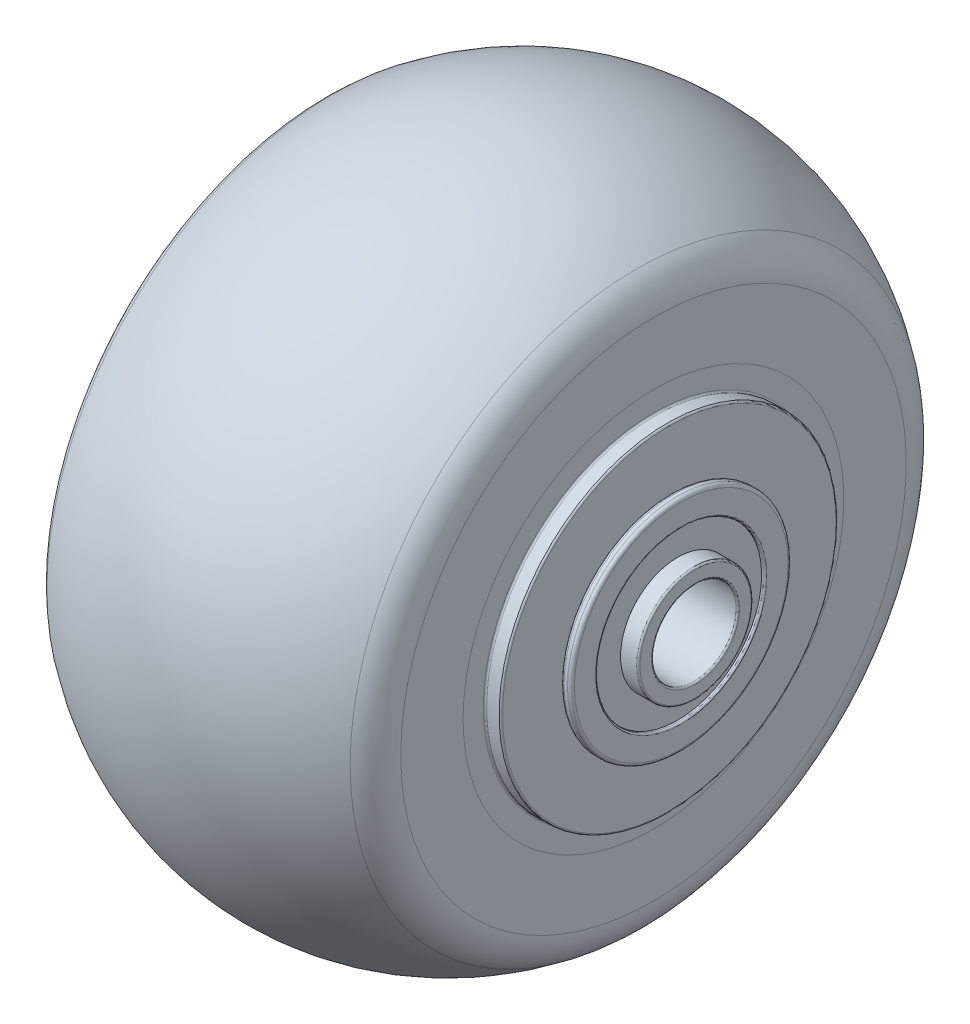
ISO-10303-21;
HEADER;
FILE_DESCRIPTION(('STEP AP214'),'2;1');
FILE_NAME('part.step','',(''),(''),'','','');
FILE_SCHEMA(('AUTOMOTIVE_DESIGN { 1 0 10303 214 1 1 1 1 }'));
ENDSEC;
DATA;
#1=APPLICATION_CONTEXT('core data for automotive mechanical design processes');
#2=APPLICATION_PROTOCOL_DEFINITION('international standard','automotive_design',2000,#1);
#3=PRODUCT_CONTEXT('',#1,'mechanical');
#4=PRODUCT('Part','Part','',(#3));
#5=PRODUCT_RELATED_PRODUCT_CATEGORY('part','',(#4));
#6=PRODUCT_DEFINITION_FORMATION('','',#4);
#7=PRODUCT_DEFINITION_CONTEXT('part definition',#1,'design');
#8=PRODUCT_DEFINITION('design','',#6,#7);
#9=PRODUCT_DEFINITION_SHAPE('','',#8);
#10=(LENGTH_UNIT() NAMED_UNIT(*) SI_UNIT(.MILLI.,.METRE.));
#11=(NAMED_UNIT(*) PLANE_ANGLE_UNIT() SI_UNIT($,.RADIAN.));
#12=(NAMED_UNIT(*) SI_UNIT($,.STERADIAN.) SOLID_ANGLE_UNIT());
#13=UNCERTAINTY_MEASURE_WITH_UNIT(LENGTH_MEASURE(1.E-05),#10,'distance_accuracy_value','');
#14=(GEOMETRIC_REPRESENTATION_CONTEXT(3) GLOBAL_UNCERTAINTY_ASSIGNED_CONTEXT((#13)) GLOBAL_UNIT_ASSIGNED_CONTEXT((#10,
#11,#12)) REPRESENTATION_CONTEXT('',''));
#15=CARTESIAN_POINT('',(0.,0.,0.));
#16=DIRECTION('',(0.,0.,1.));
#17=DIRECTION('',(1.,0.,0.));
#18=AXIS2_PLACEMENT_3D('',#15,#16,#17);
#19=CARTESIAN_POINT('',(-29.0724166666667,0.,0.));
#20=DIRECTION('',(-1.,0.,0.));
#21=DIRECTION('',(0.,0.,-1.));
#22=AXIS2_PLACEMENT_3D('',#19,#20,#21);
#23=PLANE('',#22);
#24=CARTESIAN_POINT('',(-29.0724166666667,0.,0.));
#25=DIRECTION('',(1.,0.,0.));
#26=DIRECTION('',(0.,0.,-1.));
#27=AXIS2_PLACEMENT_3D('',#24,#25,#26);
#28=CIRCLE('',#27,12.639278125);
#29=CARTESIAN_POINT('',(-29.0724166666667,0.,-12.639278125));
#30=VERTEX_POINT('',#29);
#31=EDGE_CURVE('E11',#30,#30,#28,.T.);
#32=ORIENTED_EDGE('',*,*,#31,.F.);
#33=EDGE_LOOP('',(#32));
#34=FACE_BOUND('',#33,.T.);
#35=CARTESIAN_POINT('',(-29.0724166666667,0.,0.));
#36=DIRECTION('',(1.,0.,0.));
#37=DIRECTION('',(0.,0.,-1.));
#38=AXIS2_PLACEMENT_3D('',#35,#36,#37);
#39=CIRCLE('',#38,8.64155625);
#40=CARTESIAN_POINT('',(-29.0724166666667,0.,-8.64155625));
#41=VERTEX_POINT('',#40);
#42=EDGE_CURVE('E56',#41,#41,#39,.T.);
#43=ORIENTED_EDGE('',*,*,#42,.T.);
#44=EDGE_LOOP('',(#43));
#45=FACE_BOUND('',#44,.T.);
#46=ADVANCED_FACE('F45',(#34,#45),#23,.T.);
#47=CARTESIAN_POINT('',(-28.5538333333333,0.,0.));
#48=DIRECTION('',(-1.,0.,0.));
#49=DIRECTION('',(0.,0.,-1.));
#50=AXIS2_PLACEMENT_3D('',#47,#48,#49);
#51=PLANE('',#50);
#52=CARTESIAN_POINT('',(-28.5538333333333,0.,0.));
#53=DIRECTION('',(1.,0.,0.));
#54=DIRECTION('',(0.,0.,-1.));
#55=AXIS2_PLACEMENT_3D('',#52,#53,#54);
#56=CIRCLE('',#55,12.639278125);
#57=CARTESIAN_POINT('',(-28.5538333333333,0.,-12.639278125));
#58=VERTEX_POINT('',#57);
#59=EDGE_CURVE('E49',#58,#58,#56,.T.);
#60=ORIENTED_EDGE('',*,*,#59,.T.);
#61=EDGE_LOOP('',(#60));
#62=FACE_BOUND('',#61,.T.);
#63=CARTESIAN_POINT('',(-28.5538333333333,0.,0.));
#64=DIRECTION('',(1.,0.,0.));
#65=DIRECTION('',(0.,0.,-1.));
#66=AXIS2_PLACEMENT_3D('',#63,#64,#65);
#67=CIRCLE('',#66,8.64155625);
#68=CARTESIAN_POINT('',(-28.5538333333333,0.,-8.64155625));
#69=VERTEX_POINT('',#68);
#70=EDGE_CURVE('E58',#69,#69,#67,.T.);
#71=ORIENTED_EDGE('',*,*,#70,.F.);
#72=EDGE_LOOP('',(#71));
#73=FACE_BOUND('',#72,.T.);
#74=ADVANCED_FACE('F71',(#62,#73),#51,.F.);
#75=CARTESIAN_POINT('',(-29.0724166666667,0.,0.));
#76=DIRECTION('',(1.,0.,0.));
#77=DIRECTION('',(0.,0.,1.));
#78=AXIS2_PLACEMENT_3D('',#75,#76,#77);
#79=CYLINDRICAL_SURFACE('',#78,12.639278125);
#80=ORIENTED_EDGE('',*,*,#31,.T.);
#81=EDGE_LOOP('',(#80));
#82=FACE_BOUND('',#81,.T.);
#83=ORIENTED_EDGE('',*,*,#59,.F.);
#84=EDGE_LOOP('',(#83));
#85=FACE_BOUND('',#84,.T.);
#86=ADVANCED_FACE('F47',(#82,#85),#79,.T.);
#87=CARTESIAN_POINT('',(-29.0724166666667,0.,0.));
#88=DIRECTION('',(1.,0.,0.));
#89=DIRECTION('',(0.,0.,1.));
#90=AXIS2_PLACEMENT_3D('',#87,#88,#89);
#91=CYLINDRICAL_SURFACE('',#90,8.64155625);
#92=ORIENTED_EDGE('',*,*,#42,.F.);
#93=EDGE_LOOP('',(#92));
#94=FACE_BOUND('',#93,.T.);
#95=ORIENTED_EDGE('',*,*,#70,.T.);
#96=EDGE_LOOP('',(#95));
#97=FACE_BOUND('',#96,.T.);
#98=ADVANCED_FACE('F65',(#94,#97),#91,.F.);
#99=CLOSED_SHELL('',(#46,#74,#86,#98));
#100=MANIFOLD_SOLID_BREP('B2',#99);
#101=CARTESIAN_POINT('',(29.0724166666667,0.,0.));
#102=DIRECTION('',(1.,0.,0.));
#103=DIRECTION('',(0.,0.,-1.));
#104=AXIS2_PLACEMENT_3D('',#101,#102,#103);
#105=PLANE('',#104);
#106=CARTESIAN_POINT('',(29.0724166666667,0.,0.));
#107=DIRECTION('',(1.,0.,0.));
#108=DIRECTION('',(0.,0.,-1.));
#109=AXIS2_PLACEMENT_3D('',#106,#107,#108);
#110=CIRCLE('',#109,12.639278125);
#111=CARTESIAN_POINT('',(29.0724166666667,0.,-12.639278125));
#112=VERTEX_POINT('',#111);
#113=EDGE_CURVE('E44',#112,#112,#110,.T.);
#114=ORIENTED_EDGE('',*,*,#113,.T.);
#115=EDGE_LOOP('',(#114));
#116=FACE_BOUND('',#115,.T.);
#117=CARTESIAN_POINT('',(29.0724166666667,0.,0.));
#118=DIRECTION('',(1.,0.,0.));
#119=DIRECTION('',(0.,0.,-1.));
#120=AXIS2_PLACEMENT_3D('',#117,#118,#119);
#121=CIRCLE('',#120,8.64155625);
#122=CARTESIAN_POINT('',(29.0724166666667,0.,-8.64155625));
#123=VERTEX_POINT('',#122);
#124=EDGE_CURVE('E125',#123,#123,#121,.T.);
#125=ORIENTED_EDGE('',*,*,#124,.F.);
#126=EDGE_LOOP('',(#125));
#127=FACE_BOUND('',#126,.T.);
#128=ADVANCED_FACE('F114',(#116,#127),#105,.T.);
#129=CARTESIAN_POINT('',(28.5538333333333,0.,0.));
#130=DIRECTION('',(1.,0.,0.));
#131=DIRECTION('',(0.,0.,-1.));
#132=AXIS2_PLACEMENT_3D('',#129,#130,#131);
#133=PLANE('',#132);
#134=CARTESIAN_POINT('',(28.5538333333333,0.,0.));
#135=DIRECTION('',(1.,0.,0.));
#136=DIRECTION('',(0.,0.,-1.));
#137=AXIS2_PLACEMENT_3D('',#134,#135,#136);
#138=CIRCLE('',#137,12.639278125);
#139=CARTESIAN_POINT('',(28.5538333333333,0.,-12.639278125));
#140=VERTEX_POINT('',#139);
#141=EDGE_CURVE('E118',#140,#140,#138,.T.);
#142=ORIENTED_EDGE('',*,*,#141,.F.);
#143=EDGE_LOOP('',(#142));
#144=FACE_BOUND('',#143,.T.);
#145=CARTESIAN_POINT('',(28.5538333333333,0.,0.));
#146=DIRECTION('',(1.,0.,0.));
#147=DIRECTION('',(0.,0.,-1.));
#148=AXIS2_PLACEMENT_3D('',#145,#146,#147);
#149=CIRCLE('',#148,8.64155625);
#150=CARTESIAN_POINT('',(28.5538333333333,0.,-8.64155625));
#151=VERTEX_POINT('',#150);
#152=EDGE_CURVE('E127',#151,#151,#149,.T.);
#153=ORIENTED_EDGE('',*,*,#152,.T.);
#154=EDGE_LOOP('',(#153));
#155=FACE_BOUND('',#154,.T.);
#156=ADVANCED_FACE('F137',(#144,#155),#133,.F.);
#157=CARTESIAN_POINT('',(29.0724166666667,0.,0.));
#158=DIRECTION('',(-1.,0.,0.));
#159=DIRECTION('',(0.,0.,1.));
#160=AXIS2_PLACEMENT_3D('',#157,#158,#159);
#161=CYLINDRICAL_SURFACE('',#160,12.639278125);
#162=ORIENTED_EDGE('',*,*,#113,.F.);
#163=EDGE_LOOP('',(#162));
#164=FACE_BOUND('',#163,.T.);
#165=ORIENTED_EDGE('',*,*,#141,.T.);
#166=EDGE_LOOP('',(#165));
#167=FACE_BOUND('',#166,.T.);
#168=ADVANCED_FACE('F116',(#164,#167),#161,.T.);
#169=CARTESIAN_POINT('',(29.0724166666667,0.,0.));
#170=DIRECTION('',(-1.,0.,0.));
#171=DIRECTION('',(0.,0.,1.));
#172=AXIS2_PLACEMENT_3D('',#169,#170,#171);
#173=CYLINDRICAL_SURFACE('',#172,8.64155625);
#174=ORIENTED_EDGE('',*,*,#124,.T.);
#175=EDGE_LOOP('',(#174));
#176=FACE_BOUND('',#175,.T.);
#177=ORIENTED_EDGE('',*,*,#152,.F.);
#178=EDGE_LOOP('',(#177));
#179=FACE_BOUND('',#178,.T.);
#180=ADVANCED_FACE('F133',(#176,#179),#173,.F.);
#181=CLOSED_SHELL('',(#128,#156,#168,#180));
#182=MANIFOLD_SOLID_BREP('B6',#181);
#183=CARTESIAN_POINT('',(-27.78125,0.,0.));
#184=DIRECTION('',(-1.,0.,0.));
#185=DIRECTION('',(0.,0.,1.));
#186=AXIS2_PLACEMENT_3D('',#183,#184,#185);
#187=CYLINDRICAL_SURFACE('',#186,25.40127);
#188=CARTESIAN_POINT('',(25.654,0.,0.));
#189=DIRECTION('',(1.,0.,0.));
#190=DIRECTION('',(0.,0.,-1.));
#191=AXIS2_PLACEMENT_3D('',#188,#189,#190);
#192=CIRCLE('',#191,25.40127);
#193=CARTESIAN_POINT('',(25.654,0.,-25.40127));
#194=VERTEX_POINT('',#193);
#195=EDGE_CURVE('E190',#194,#194,#192,.T.);
#196=ORIENTED_EDGE('',*,*,#195,.T.);
#197=EDGE_LOOP('',(#196));
#198=FACE_BOUND('',#197,.T.);
#199=CARTESIAN_POINT('',(27.52725,0.,0.));
#200=DIRECTION('',(1.,0.,0.));
#201=DIRECTION('',(0.,0.,-1.));
#202=AXIS2_PLACEMENT_3D('',#199,#200,#201);
#203=CIRCLE('',#202,25.40127);
#204=CARTESIAN_POINT('',(27.52725,0.,-25.40127));
#205=VERTEX_POINT('',#204);
#206=EDGE_CURVE('E194',#205,#205,#203,.F.);
#207=ORIENTED_EDGE('',*,*,#206,.T.);
#208=EDGE_LOOP('',(#207));
#209=FACE_BOUND('',#208,.T.);
#210=ADVANCED_FACE('F183',(#198,#209),#187,.T.);
#211=CARTESIAN_POINT('',(25.4,-28.702,0.));
#212=DIRECTION('',(1.,0.,0.));
#213=DIRECTION('',(0.,0.,-1.));
#214=AXIS2_PLACEMENT_3D('',#211,#212,#213);
#215=PLANE('',#214);
#216=CARTESIAN_POINT('',(25.4,0.,0.));
#217=DIRECTION('',(1.,0.,0.));
#218=DIRECTION('',(0.,0.,-1.));
#219=AXIS2_PLACEMENT_3D('',#216,#217,#218);
#220=CIRCLE('',#219,25.65527);
#221=CARTESIAN_POINT('',(25.4,0.,-25.65527));
#222=VERTEX_POINT('',#221);
#223=EDGE_CURVE('E198',#222,#222,#220,.F.);
#224=ORIENTED_EDGE('',*,*,#223,.T.);
#225=EDGE_LOOP('',(#224));
#226=FACE_BOUND('',#225,.T.);
#227=CARTESIAN_POINT('',(25.4,0.,0.));
#228=DIRECTION('',(-1.,0.,0.));
#229=DIRECTION('',(0.,0.,1.));
#230=AXIS2_PLACEMENT_3D('',#227,#228,#229);
#231=CIRCLE('',#230,28.702);
#232=CARTESIAN_POINT('',(25.4,0.,28.702));
#233=VERTEX_POINT('',#232);
#234=EDGE_CURVE('E215',#233,#233,#231,.T.);
#235=ORIENTED_EDGE('',*,*,#234,.F.);
#236=EDGE_LOOP('',(#235));
#237=FACE_BOUND('',#236,.T.);
#238=ADVANCED_FACE('F245',(#226,#237),#215,.T.);
#239=CARTESIAN_POINT('',(-27.78125,0.,0.));
#240=DIRECTION('',(-1.,0.,0.));
#241=DIRECTION('',(0.,0.,1.));
#242=AXIS2_PLACEMENT_3D('',#239,#240,#241);
#243=CYLINDRICAL_SURFACE('',#242,28.702);
#244=ORIENTED_EDGE('',*,*,#234,.T.);
#245=EDGE_LOOP('',(#244));
#246=FACE_BOUND('',#245,.T.);
#247=CARTESIAN_POINT('',(-25.4,0.,0.));
#248=DIRECTION('',(-1.,0.,0.));
#249=DIRECTION('',(0.,0.,1.));
#250=AXIS2_PLACEMENT_3D('',#247,#248,#249);
#251=CIRCLE('',#250,28.702);
#252=CARTESIAN_POINT('',(-25.4,0.,28.702));
#253=VERTEX_POINT('',#252);
#254=EDGE_CURVE('E218',#253,#253,#251,.T.);
#255=ORIENTED_EDGE('',*,*,#254,.F.);
#256=EDGE_LOOP('',(#255));
#257=FACE_BOUND('',#256,.T.);
#258=ADVANCED_FACE('F250',(#246,#257),#243,.T.);
#259=CARTESIAN_POINT('',(-25.4,-28.702,0.));
#260=DIRECTION('',(-1.,0.,0.));
#261=DIRECTION('',(0.,0.,1.));
#262=AXIS2_PLACEMENT_3D('',#259,#260,#261);
#263=PLANE('',#262);
#264=CARTESIAN_POINT('',(-25.4,0.,0.));
#265=DIRECTION('',(-1.,0.,0.));
#266=DIRECTION('',(0.,0.,1.));
#267=AXIS2_PLACEMENT_3D('',#264,#265,#266);
#268=CIRCLE('',#267,25.65527);
#269=CARTESIAN_POINT('',(-25.4,0.,25.65527));
#270=VERTEX_POINT('',#269);
#271=EDGE_CURVE('E206',#270,#270,#268,.F.);
#272=ORIENTED_EDGE('',*,*,#271,.T.);
#273=EDGE_LOOP('',(#272));
#274=FACE_BOUND('',#273,.T.);
#275=ORIENTED_EDGE('',*,*,#254,.T.);
#276=EDGE_LOOP('',(#275));
#277=FACE_BOUND('',#276,.T.);
#278=ADVANCED_FACE('F276',(#274,#277),#263,.T.);
#279=CARTESIAN_POINT('',(-27.78125,0.,0.));
#280=DIRECTION('',(-1.,0.,0.));
#281=DIRECTION('',(0.,0.,1.));
#282=AXIS2_PLACEMENT_3D('',#279,#280,#281);
#283=CYLINDRICAL_SURFACE('',#282,25.40127);
#284=CARTESIAN_POINT('',(-25.654,0.,0.));
#285=DIRECTION('',(-1.,0.,0.));
#286=DIRECTION('',(0.,0.,1.));
#287=AXIS2_PLACEMENT_3D('',#284,#285,#286);
#288=CIRCLE('',#287,25.40127);
#289=CARTESIAN_POINT('',(-25.654,0.,25.40127));
#290=VERTEX_POINT('',#289);
#291=EDGE_CURVE('E209',#290,#290,#288,.T.);
#292=ORIENTED_EDGE('',*,*,#291,.T.);
#293=EDGE_LOOP('',(#292));
#294=FACE_BOUND('',#293,.T.);
#295=CARTESIAN_POINT('',(-27.52725,0.,0.));
#296=DIRECTION('',(-1.,0.,0.));
#297=DIRECTION('',(0.,0.,1.));
#298=AXIS2_PLACEMENT_3D('',#295,#296,#297);
#299=CIRCLE('',#298,25.40127);
#300=CARTESIAN_POINT('',(-27.52725,0.,25.40127));
#301=VERTEX_POINT('',#300);
#302=EDGE_CURVE('E212',#301,#301,#299,.F.);
#303=ORIENTED_EDGE('',*,*,#302,.T.);
#304=EDGE_LOOP('',(#303));
#305=FACE_BOUND('',#304,.T.);
#306=ADVANCED_FACE('F241',(#294,#305),#283,.T.);
#307=CARTESIAN_POINT('',(-27.78125,-25.40127,0.));
#308=DIRECTION('',(-1.,0.,0.));
#309=DIRECTION('',(0.,0.,1.));
#310=AXIS2_PLACEMENT_3D('',#307,#308,#309);
#311=PLANE('',#310);
#312=CARTESIAN_POINT('',(-27.78125,0.,0.));
#313=DIRECTION('',(-1.,0.,0.));
#314=DIRECTION('',(0.,0.,1.));
#315=AXIS2_PLACEMENT_3D('',#312,#313,#314);
#316=CIRCLE('',#315,25.14727);
#317=CARTESIAN_POINT('',(-27.78125,0.,25.14727));
#318=VERTEX_POINT('',#317);
#319=EDGE_CURVE('E203',#318,#318,#316,.T.);
#320=ORIENTED_EDGE('',*,*,#319,.T.);
#321=EDGE_LOOP('',(#320));
#322=FACE_BOUND('',#321,.T.);
#323=CARTESIAN_POINT('',(-27.78125,0.,0.));
#324=DIRECTION('',(-1.,0.,0.));
#325=DIRECTION('',(0.,0.,1.));
#326=AXIS2_PLACEMENT_3D('',#323,#324,#325);
#327=CIRCLE('',#326,15.08125);
#328=CARTESIAN_POINT('',(-27.78125,0.,15.08125));
#329=VERTEX_POINT('',#328);
#330=EDGE_CURVE('E221',#329,#329,#327,.T.);
#331=ORIENTED_EDGE('',*,*,#330,.F.);
#332=EDGE_LOOP('',(#331));
#333=FACE_BOUND('',#332,.T.);
#334=ADVANCED_FACE('F232',(#322,#333),#311,.T.);
#335=CARTESIAN_POINT('',(-27.78125,0.,0.));
#336=DIRECTION('',(-1.,0.,0.));
#337=DIRECTION('',(0.,0.,1.));
#338=AXIS2_PLACEMENT_3D('',#335,#336,#337);
#339=CYLINDRICAL_SURFACE('',#338,15.08125);
#340=ORIENTED_EDGE('',*,*,#330,.T.);
#341=EDGE_LOOP('',(#340));
#342=FACE_BOUND('',#341,.T.);
#343=CARTESIAN_POINT('',(27.78125,0.,0.));
#344=DIRECTION('',(-1.,0.,0.));
#345=DIRECTION('',(0.,0.,1.));
#346=AXIS2_PLACEMENT_3D('',#343,#344,#345);
#347=CIRCLE('',#346,15.08125);
#348=CARTESIAN_POINT('',(27.78125,0.,15.08125));
#349=VERTEX_POINT('',#348);
#350=EDGE_CURVE('E224',#349,#349,#347,.T.);
#351=ORIENTED_EDGE('',*,*,#350,.F.);
#352=EDGE_LOOP('',(#351));
#353=FACE_BOUND('',#352,.T.);
#354=ADVANCED_FACE('F230',(#342,#353),#339,.F.);
#355=CARTESIAN_POINT('',(27.78125,-25.40127,0.));
#356=DIRECTION('',(1.,0.,0.));
#357=DIRECTION('',(0.,0.,-1.));
#358=AXIS2_PLACEMENT_3D('',#355,#356,#357);
#359=PLANE('',#358);
#360=CARTESIAN_POINT('',(27.78125,0.,0.));
#361=DIRECTION('',(1.,0.,0.));
#362=DIRECTION('',(0.,0.,-1.));
#363=AXIS2_PLACEMENT_3D('',#360,#361,#362);
#364=CIRCLE('',#363,25.14727);
#365=CARTESIAN_POINT('',(27.78125,0.,-25.14727));
#366=VERTEX_POINT('',#365);
#367=EDGE_CURVE('E113',#366,#366,#364,.T.);
#368=ORIENTED_EDGE('',*,*,#367,.T.);
#369=EDGE_LOOP('',(#368));
#370=FACE_BOUND('',#369,.T.);
#371=ORIENTED_EDGE('',*,*,#350,.T.);
#372=EDGE_LOOP('',(#371));
#373=FACE_BOUND('',#372,.T.);
#374=ADVANCED_FACE('F228',(#370,#373),#359,.T.);
#375=CARTESIAN_POINT('',(-25.654,0.,0.));
#376=DIRECTION('',(-1.,0.,0.));
#377=DIRECTION('',(0.,0.,1.));
#378=AXIS2_PLACEMENT_3D('',#375,#376,#377);
#379=TOROIDAL_SURFACE('',#378,25.65527,0.254);
#380=ORIENTED_EDGE('',*,*,#271,.F.);
#381=EDGE_LOOP('',(#380));
#382=FACE_BOUND('',#381,.T.);
#383=ORIENTED_EDGE('',*,*,#291,.F.);
#384=EDGE_LOOP('',(#383));
#385=FACE_BOUND('',#384,.T.);
#386=ADVANCED_FACE('F239',(#382,#385),#379,.F.);
#387=CARTESIAN_POINT('',(-27.52725,0.,0.));
#388=DIRECTION('',(-1.,0.,0.));
#389=DIRECTION('',(0.,0.,1.));
#390=AXIS2_PLACEMENT_3D('',#387,#388,#389);
#391=TOROIDAL_SURFACE('',#390,25.14727,0.254);
#392=ORIENTED_EDGE('',*,*,#302,.F.);
#393=EDGE_LOOP('',(#392));
#394=FACE_BOUND('',#393,.T.);
#395=ORIENTED_EDGE('',*,*,#319,.F.);
#396=EDGE_LOOP('',(#395));
#397=FACE_BOUND('',#396,.T.);
#398=ADVANCED_FACE('F258',(#394,#397),#391,.T.);
#399=CARTESIAN_POINT('',(25.654,0.,0.));
#400=DIRECTION('',(1.,0.,0.));
#401=DIRECTION('',(0.,0.,-1.));
#402=AXIS2_PLACEMENT_3D('',#399,#400,#401);
#403=TOROIDAL_SURFACE('',#402,25.65527,0.254);
#404=ORIENTED_EDGE('',*,*,#195,.F.);
#405=EDGE_LOOP('',(#404));
#406=FACE_BOUND('',#405,.T.);
#407=ORIENTED_EDGE('',*,*,#223,.F.);
#408=EDGE_LOOP('',(#407));
#409=FACE_BOUND('',#408,.T.);
#410=ADVANCED_FACE('F261',(#406,#409),#403,.F.);
#411=CARTESIAN_POINT('',(27.52725,0.,0.));
#412=DIRECTION('',(1.,0.,0.));
#413=DIRECTION('',(0.,0.,-1.));
#414=AXIS2_PLACEMENT_3D('',#411,#412,#413);
#415=TOROIDAL_SURFACE('',#414,25.14727,0.254);
#416=ORIENTED_EDGE('',*,*,#367,.F.);
#417=EDGE_LOOP('',(#416));
#418=FACE_BOUND('',#417,.T.);
#419=ORIENTED_EDGE('',*,*,#206,.F.);
#420=EDGE_LOOP('',(#419));
#421=FACE_BOUND('',#420,.T.);
#422=ADVANCED_FACE('F185',(#418,#421),#415,.T.);
#423=CLOSED_SHELL('',(#210,#238,#258,#278,#306,#334,#354,#374,#386,#398,#410,#422));
#424=MANIFOLD_SOLID_BREP('B39',#423);
#425=CARTESIAN_POINT('',(25.4,-38.1,0.));
#426=DIRECTION('',(1.,0.,0.));
#427=DIRECTION('',(0.,0.,-1.));
#428=AXIS2_PLACEMENT_3D('',#425,#426,#427);
#429=PLANE('',#428);
#430=CARTESIAN_POINT('',(25.4,0.,0.));
#431=DIRECTION('',(-1.,0.,0.));
#432=DIRECTION('',(0.,0.,1.));
#433=AXIS2_PLACEMENT_3D('',#430,#431,#432);
#434=CIRCLE('',#433,28.702);
#435=CARTESIAN_POINT('',(25.4,0.,28.702));
#436=VERTEX_POINT('',#435);
#437=EDGE_CURVE('E396',#436,#436,#434,.T.);
#438=ORIENTED_EDGE('',*,*,#437,.T.);
#439=EDGE_LOOP('',(#438));
#440=FACE_BOUND('',#439,.T.);
#441=CARTESIAN_POINT('',(25.4,0.,0.));
#442=DIRECTION('',(-1.,0.,0.));
#443=DIRECTION('',(0.,0.,1.));
#444=AXIS2_PLACEMENT_3D('',#441,#442,#443);
#445=CIRCLE('',#444,38.1);
#446=CARTESIAN_POINT('',(25.4,0.,38.1));
#447=VERTEX_POINT('',#446);
#448=EDGE_CURVE('E182',#447,#447,#445,.T.);
#449=ORIENTED_EDGE('',*,*,#448,.F.);
#450=EDGE_LOOP('',(#449));
#451=FACE_BOUND('',#450,.T.);
#452=ADVANCED_FACE('F374',(#440,#451),#429,.T.);
#453=CARTESIAN_POINT('',(19.05,0.,0.));
#454=DIRECTION('',(-1.,0.,0.));
#455=DIRECTION('',(0.,0.,1.));
#456=AXIS2_PLACEMENT_3D('',#453,#454,#455);
#457=TOROIDAL_SURFACE('',#456,38.1,6.35000000000001);
#458=ORIENTED_EDGE('',*,*,#448,.T.);
#459=EDGE_LOOP('',(#458));
#460=FACE_BOUND('',#459,.T.);
#461=CARTESIAN_POINT('',(22.86,0.,0.));
#462=DIRECTION('',(-1.,0.,0.));
#463=DIRECTION('',(0.,0.,1.));
#464=AXIS2_PLACEMENT_3D('',#461,#462,#463);
#465=CIRCLE('',#464,43.18);
#466=CARTESIAN_POINT('',(22.86,0.,43.18));
#467=VERTEX_POINT('',#466);
#468=EDGE_CURVE('E380',#467,#467,#465,.T.);
#469=ORIENTED_EDGE('',*,*,#468,.F.);
#470=EDGE_LOOP('',(#469));
#471=FACE_BOUND('',#470,.T.);
#472=ADVANCED_FACE('F414',(#460,#471),#457,.T.);
#473=CARTESIAN_POINT('',(0.,0.,0.));
#474=DIRECTION('',(-1.,0.,0.));
#475=DIRECTION('',(0.,0.,1.));
#476=AXIS2_PLACEMENT_3D('',#473,#474,#475);
#477=DEGENERATE_TOROIDAL_SURFACE('',#476,12.7,38.1,.T.);
#478=ORIENTED_EDGE('',*,*,#468,.T.);
#479=EDGE_LOOP('',(#478));
#480=FACE_BOUND('',#479,.T.);
#481=CARTESIAN_POINT('',(-22.86,0.,0.));
#482=DIRECTION('',(-1.,0.,0.));
#483=DIRECTION('',(0.,0.,1.));
#484=AXIS2_PLACEMENT_3D('',#481,#482,#483);
#485=CIRCLE('',#484,43.18);
#486=CARTESIAN_POINT('',(-22.86,0.,43.18));
#487=VERTEX_POINT('',#486);
#488=EDGE_CURVE('E384',#487,#487,#485,.T.);
#489=ORIENTED_EDGE('',*,*,#488,.F.);
#490=EDGE_LOOP('',(#489));
#491=FACE_BOUND('',#490,.T.);
#492=ADVANCED_FACE('F418',(#480,#491),#477,.T.);
#493=CARTESIAN_POINT('',(-19.05,0.,0.));
#494=DIRECTION('',(-1.,0.,0.));
#495=DIRECTION('',(0.,0.,1.));
#496=AXIS2_PLACEMENT_3D('',#493,#494,#495);
#497=TOROIDAL_SURFACE('',#496,38.1,6.35);
#498=ORIENTED_EDGE('',*,*,#488,.T.);
#499=EDGE_LOOP('',(#498));
#500=FACE_BOUND('',#499,.T.);
#501=CARTESIAN_POINT('',(-25.4,0.,0.));
#502=DIRECTION('',(-1.,0.,0.));
#503=DIRECTION('',(0.,0.,1.));
#504=AXIS2_PLACEMENT_3D('',#501,#502,#503);
#505=CIRCLE('',#504,38.1);
#506=CARTESIAN_POINT('',(-25.4,0.,38.1));
#507=VERTEX_POINT('',#506);
#508=EDGE_CURVE('E388',#507,#507,#505,.T.);
#509=ORIENTED_EDGE('',*,*,#508,.F.);
#510=EDGE_LOOP('',(#509));
#511=FACE_BOUND('',#510,.T.);
#512=ADVANCED_FACE('F410',(#500,#511),#497,.T.);
#513=CARTESIAN_POINT('',(-25.4,-38.1,0.));
#514=DIRECTION('',(-1.,0.,0.));
#515=DIRECTION('',(0.,0.,1.));
#516=AXIS2_PLACEMENT_3D('',#513,#514,#515);
#517=PLANE('',#516);
#518=ORIENTED_EDGE('',*,*,#508,.T.);
#519=EDGE_LOOP('',(#518));
#520=FACE_BOUND('',#519,.T.);
#521=CARTESIAN_POINT('',(-25.4,0.,0.));
#522=DIRECTION('',(-1.,0.,0.));
#523=DIRECTION('',(0.,0.,1.));
#524=AXIS2_PLACEMENT_3D('',#521,#522,#523);
#525=CIRCLE('',#524,28.702);
#526=CARTESIAN_POINT('',(-25.4,0.,28.702));
#527=VERTEX_POINT('',#526);
#528=EDGE_CURVE('E393',#527,#527,#525,.T.);
#529=ORIENTED_EDGE('',*,*,#528,.F.);
#530=EDGE_LOOP('',(#529));
#531=FACE_BOUND('',#530,.T.);
#532=ADVANCED_FACE('F404',(#520,#531),#517,.T.);
#533=CARTESIAN_POINT('',(-27.78125,0.,0.));
#534=DIRECTION('',(-1.,0.,0.));
#535=DIRECTION('',(0.,0.,1.));
#536=AXIS2_PLACEMENT_3D('',#533,#534,#535);
#537=CYLINDRICAL_SURFACE('',#536,28.702);
#538=ORIENTED_EDGE('',*,*,#528,.T.);
#539=EDGE_LOOP('',(#538));
#540=FACE_BOUND('',#539,.T.);
#541=ORIENTED_EDGE('',*,*,#437,.F.);
#542=EDGE_LOOP('',(#541));
#543=FACE_BOUND('',#542,.T.);
#544=ADVANCED_FACE('F402',(#540,#543),#537,.F.);
#545=CLOSED_SHELL('',(#452,#472,#492,#512,#532,#544));
#546=MANIFOLD_SOLID_BREP('B108',#545);
#547=CARTESIAN_POINT('',(28.03525,-16.1184166666667,0.));
#548=DIRECTION('',(-1.,0.,0.));
#549=DIRECTION('',(0.,0.,1.));
#550=AXIS2_PLACEMENT_3D('',#547,#548,#549);
#551=PLANE('',#550);
#552=CARTESIAN_POINT('',(28.03525,0.,0.));
#553=DIRECTION('',(-1.,0.,0.));
#554=DIRECTION('',(0.,0.,1.));
#555=AXIS2_PLACEMENT_3D('',#552,#553,#554);
#556=CIRCLE('',#555,16.1184166666667);
#557=CARTESIAN_POINT('',(28.03525,0.,16.1184166666667));
#558=VERTEX_POINT('',#557);
#559=EDGE_CURVE('E548',#558,#558,#556,.T.);
#560=ORIENTED_EDGE('',*,*,#559,.T.);
#561=EDGE_LOOP('',(#560));
#562=FACE_BOUND('',#561,.T.);
#563=CARTESIAN_POINT('',(28.03525,0.,0.));
#564=DIRECTION('',(-1.,0.,0.));
#565=DIRECTION('',(0.,0.,1.));
#566=AXIS2_PLACEMENT_3D('',#563,#564,#565);
#567=CIRCLE('',#566,15.08125);
#568=CARTESIAN_POINT('',(28.03525,0.,15.08125));
#569=VERTEX_POINT('',#568);
#570=EDGE_CURVE('E509',#569,#569,#567,.T.);
#571=ORIENTED_EDGE('',*,*,#570,.F.);
#572=EDGE_LOOP('',(#571));
#573=FACE_BOUND('',#572,.T.);
#574=ADVANCED_FACE('F465',(#562,#573),#551,.T.);
#575=CARTESIAN_POINT('',(-27.78125,0.,0.));
#576=DIRECTION('',(-1.,0.,0.));
#577=DIRECTION('',(0.,0.,1.));
#578=AXIS2_PLACEMENT_3D('',#575,#576,#577);
#579=CYLINDRICAL_SURFACE('',#578,15.08125);
#580=ORIENTED_EDGE('',*,*,#570,.T.);
#581=EDGE_LOOP('',(#580));
#582=FACE_BOUND('',#581,.T.);
#583=CARTESIAN_POINT('',(-28.03525,0.,0.));
#584=DIRECTION('',(-1.,0.,0.));
#585=DIRECTION('',(0.,0.,1.));
#586=AXIS2_PLACEMENT_3D('',#583,#584,#585);
#587=CIRCLE('',#586,15.08125);
#588=CARTESIAN_POINT('',(-28.03525,0.,15.08125));
#589=VERTEX_POINT('',#588);
#590=EDGE_CURVE('E512',#589,#589,#587,.T.);
#591=ORIENTED_EDGE('',*,*,#590,.F.);
#592=EDGE_LOOP('',(#591));
#593=FACE_BOUND('',#592,.T.);
#594=ADVANCED_FACE('F571',(#582,#593),#579,.T.);
#595=CARTESIAN_POINT('',(-28.03525,-16.1184166666667,0.));
#596=DIRECTION('',(1.,0.,0.));
#597=DIRECTION('',(0.,0.,-1.));
#598=AXIS2_PLACEMENT_3D('',#595,#596,#597);
#599=PLANE('',#598);
#600=ORIENTED_EDGE('',*,*,#590,.T.);
#601=EDGE_LOOP('',(#600));
#602=FACE_BOUND('',#601,.T.);
#603=CARTESIAN_POINT('',(-28.03525,0.,0.));
#604=DIRECTION('',(-1.,0.,0.));
#605=DIRECTION('',(0.,0.,1.));
#606=AXIS2_PLACEMENT_3D('',#603,#604,#605);
#607=CIRCLE('',#606,16.1184166666667);
#608=CARTESIAN_POINT('',(-28.03525,0.,16.1184166666667));
#609=VERTEX_POINT('',#608);
#610=EDGE_CURVE('E515',#609,#609,#607,.T.);
#611=ORIENTED_EDGE('',*,*,#610,.F.);
#612=EDGE_LOOP('',(#611));
#613=FACE_BOUND('',#612,.T.);
#614=ADVANCED_FACE('F576',(#602,#613),#599,.T.);
#615=CARTESIAN_POINT('',(-28.5538333333333,0.,0.));
#616=DIRECTION('',(-1.,0.,0.));
#617=DIRECTION('',(0.,0.,1.));
#618=AXIS2_PLACEMENT_3D('',#615,#616,#617);
#619=TOROIDAL_SURFACE('',#618,16.1184166666667,0.51858333333334);
#620=ORIENTED_EDGE('',*,*,#610,.T.);
#621=EDGE_LOOP('',(#620));
#622=FACE_BOUND('',#621,.T.);
#623=CARTESIAN_POINT('',(-28.5538333333333,0.,0.));
#624=DIRECTION('',(-1.,0.,0.));
#625=DIRECTION('',(0.,0.,1.));
#626=AXIS2_PLACEMENT_3D('',#623,#624,#625);
#627=CIRCLE('',#626,16.637);
#628=CARTESIAN_POINT('',(-28.5538333333333,0.,16.637));
#629=VERTEX_POINT('',#628);
#630=EDGE_CURVE('E518',#629,#629,#627,.T.);
#631=ORIENTED_EDGE('',*,*,#630,.F.);
#632=EDGE_LOOP('',(#631));
#633=FACE_BOUND('',#632,.T.);
#634=ADVANCED_FACE('F659',(#622,#633),#619,.T.);
#635=CARTESIAN_POINT('',(-27.78125,0.,0.));
#636=DIRECTION('',(-1.,0.,0.));
#637=DIRECTION('',(0.,0.,1.));
#638=AXIS2_PLACEMENT_3D('',#635,#636,#637);
#639=CYLINDRICAL_SURFACE('',#638,16.637);
#640=ORIENTED_EDGE('',*,*,#630,.T.);
#641=EDGE_LOOP('',(#640));
#642=FACE_BOUND('',#641,.T.);
#643=CARTESIAN_POINT('',(-29.0724166666667,0.,0.));
#644=DIRECTION('',(-1.,0.,0.));
#645=DIRECTION('',(0.,0.,1.));
#646=AXIS2_PLACEMENT_3D('',#643,#644,#645);
#647=CIRCLE('',#646,16.637);
#648=CARTESIAN_POINT('',(-29.0724166666667,0.,16.637));
#649=VERTEX_POINT('',#648);
#650=EDGE_CURVE('E521',#649,#649,#647,.T.);
#651=ORIENTED_EDGE('',*,*,#650,.F.);
#652=EDGE_LOOP('',(#651));
#653=FACE_BOUND('',#652,.T.);
#654=ADVANCED_FACE('F655',(#642,#653),#639,.T.);
#655=CARTESIAN_POINT('',(-29.0724166666667,0.,0.));
#656=DIRECTION('',(-1.,0.,0.));
#657=DIRECTION('',(0.,0.,1.));
#658=AXIS2_PLACEMENT_3D('',#655,#656,#657);
#659=TOROIDAL_SURFACE('',#658,16.1184166666667,0.518583333333336);
#660=ORIENTED_EDGE('',*,*,#650,.T.);
#661=EDGE_LOOP('',(#660));
#662=FACE_BOUND('',#661,.T.);
#663=CARTESIAN_POINT('',(-29.591,0.,0.));
#664=DIRECTION('',(-1.,0.,0.));
#665=DIRECTION('',(0.,0.,1.));
#666=AXIS2_PLACEMENT_3D('',#663,#664,#665);
#667=CIRCLE('',#666,16.1184166666667);
#668=CARTESIAN_POINT('',(-29.591,0.,16.1184166666667));
#669=VERTEX_POINT('',#668);
#670=EDGE_CURVE('E524',#669,#669,#667,.T.);
#671=ORIENTED_EDGE('',*,*,#670,.F.);
#672=EDGE_LOOP('',(#671));
#673=FACE_BOUND('',#672,.T.);
#674=ADVANCED_FACE('F651',(#662,#673),#659,.T.);
#675=CARTESIAN_POINT('',(-29.591,-16.1184166666667,0.));
#676=DIRECTION('',(-1.,0.,0.));
#677=DIRECTION('',(0.,0.,1.));
#678=AXIS2_PLACEMENT_3D('',#675,#676,#677);
#679=PLANE('',#678);
#680=CARTESIAN_POINT('',(-29.591,0.,0.));
#681=DIRECTION('',(-1.,0.,0.));
#682=DIRECTION('',(0.,0.,1.));
#683=AXIS2_PLACEMENT_3D('',#680,#681,#682);
#684=CIRCLE('',#683,12.893278125);
#685=CARTESIAN_POINT('',(-29.591,0.,12.893278125));
#686=VERTEX_POINT('',#685);
#687=EDGE_CURVE('E488',#686,#686,#684,.F.);
#688=ORIENTED_EDGE('',*,*,#687,.T.);
#689=EDGE_LOOP('',(#688));
#690=FACE_BOUND('',#689,.T.);
#691=ORIENTED_EDGE('',*,*,#670,.T.);
#692=EDGE_LOOP('',(#691));
#693=FACE_BOUND('',#692,.T.);
#694=ADVANCED_FACE('F647',(#690,#693),#679,.T.);
#695=CARTESIAN_POINT('',(-27.78125,0.,0.));
#696=DIRECTION('',(-1.,0.,0.));
#697=DIRECTION('',(0.,0.,1.));
#698=AXIS2_PLACEMENT_3D('',#695,#696,#697);
#699=CYLINDRICAL_SURFACE('',#698,12.639278125);
#700=CARTESIAN_POINT('',(-29.337,0.,0.));
#701=DIRECTION('',(-1.,0.,0.));
#702=DIRECTION('',(0.,0.,1.));
#703=AXIS2_PLACEMENT_3D('',#700,#701,#702);
#704=CIRCLE('',#703,12.639278125);
#705=CARTESIAN_POINT('',(-29.337,0.,12.639278125));
#706=VERTEX_POINT('',#705);
#707=EDGE_CURVE('E491',#706,#706,#704,.T.);
#708=ORIENTED_EDGE('',*,*,#707,.T.);
#709=EDGE_LOOP('',(#708));
#710=FACE_BOUND('',#709,.T.);
#711=CARTESIAN_POINT('',(-28.5538333333333,0.,0.));
#712=DIRECTION('',(-1.,0.,0.));
#713=DIRECTION('',(0.,0.,1.));
#714=AXIS2_PLACEMENT_3D('',#711,#712,#713);
#715=CIRCLE('',#714,12.639278125);
#716=CARTESIAN_POINT('',(-28.5538333333333,0.,12.639278125));
#717=VERTEX_POINT('',#716);
#718=EDGE_CURVE('E527',#717,#717,#715,.T.);
#719=ORIENTED_EDGE('',*,*,#718,.F.);
#720=EDGE_LOOP('',(#719));
#721=FACE_BOUND('',#720,.T.);
#722=ADVANCED_FACE('F643',(#710,#721),#699,.F.);
#723=CARTESIAN_POINT('',(-28.5538333333333,-12.639278125,0.));
#724=DIRECTION('',(-1.,0.,0.));
#725=DIRECTION('',(0.,0.,1.));
#726=AXIS2_PLACEMENT_3D('',#723,#724,#725);
#727=PLANE('',#726);
#728=ORIENTED_EDGE('',*,*,#718,.T.);
#729=EDGE_LOOP('',(#728));
#730=FACE_BOUND('',#729,.T.);
#731=CARTESIAN_POINT('',(-28.5538333333333,0.,0.));
#732=DIRECTION('',(-1.,0.,0.));
#733=DIRECTION('',(0.,0.,1.));
#734=AXIS2_PLACEMENT_3D('',#731,#732,#733);
#735=CIRCLE('',#734,8.64155625000001);
#736=CARTESIAN_POINT('',(-28.5538333333333,0.,8.64155625000001));
#737=VERTEX_POINT('',#736);
#738=EDGE_CURVE('E530',#737,#737,#735,.T.);
#739=ORIENTED_EDGE('',*,*,#738,.F.);
#740=EDGE_LOOP('',(#739));
#741=FACE_BOUND('',#740,.T.);
#742=ADVANCED_FACE('F639',(#730,#741),#727,.T.);
#743=CARTESIAN_POINT('',(-27.78125,0.,0.));
#744=DIRECTION('',(-1.,0.,0.));
#745=DIRECTION('',(0.,0.,1.));
#746=AXIS2_PLACEMENT_3D('',#743,#744,#745);
#747=CYLINDRICAL_SURFACE('',#746,8.64155625);
#748=CARTESIAN_POINT('',(-31.4959999999999,0.,0.));
#749=DIRECTION('',(-1.,0.,0.));
#750=DIRECTION('',(0.,0.,1.));
#751=AXIS2_PLACEMENT_3D('',#748,#749,#750);
#752=CIRCLE('',#751,8.64155625);
#753=CARTESIAN_POINT('',(-31.4959999999999,0.,8.64155625));
#754=VERTEX_POINT('',#753);
#755=EDGE_CURVE('E494',#754,#754,#752,.F.);
#756=ORIENTED_EDGE('',*,*,#755,.T.);
#757=EDGE_LOOP('',(#756));
#758=FACE_BOUND('',#757,.T.);
#759=ORIENTED_EDGE('',*,*,#738,.T.);
#760=EDGE_LOOP('',(#759));
#761=FACE_BOUND('',#760,.T.);
#762=ADVANCED_FACE('F635',(#758,#761),#747,.T.);
#763=CARTESIAN_POINT('',(-31.7499999999999,-8.64155624999999,0.));
#764=DIRECTION('',(-1.,0.,0.));
#765=DIRECTION('',(0.,0.,1.));
#766=AXIS2_PLACEMENT_3D('',#763,#764,#765);
#767=PLANE('',#766);
#768=CARTESIAN_POINT('',(-31.7499999999999,0.,0.));
#769=DIRECTION('',(-1.,0.,0.));
#770=DIRECTION('',(0.,0.,1.));
#771=AXIS2_PLACEMENT_3D('',#768,#769,#770);
#772=CIRCLE('',#771,6.60399999999999);
#773=CARTESIAN_POINT('',(-31.7499999999999,0.,6.60399999999999));
#774=VERTEX_POINT('',#773);
#775=EDGE_CURVE('E497',#774,#774,#772,.F.);
#776=ORIENTED_EDGE('',*,*,#775,.T.);
#777=EDGE_LOOP('',(#776));
#778=FACE_BOUND('',#777,.T.);
#779=CARTESIAN_POINT('',(-31.7499999999999,0.,0.));
#780=DIRECTION('',(-1.,0.,0.));
#781=DIRECTION('',(0.,0.,1.));
#782=AXIS2_PLACEMENT_3D('',#779,#780,#781);
#783=CIRCLE('',#782,8.38755625);
#784=CARTESIAN_POINT('',(-31.7499999999999,0.,8.38755625));
#785=VERTEX_POINT('',#784);
#786=EDGE_CURVE('E500',#785,#785,#783,.T.);
#787=ORIENTED_EDGE('',*,*,#786,.T.);
#788=EDGE_LOOP('',(#787));
#789=FACE_BOUND('',#788,.T.);
#790=ADVANCED_FACE('F631',(#778,#789),#767,.T.);
#791=CARTESIAN_POINT('',(-27.78125,0.,0.));
#792=DIRECTION('',(-1.,0.,0.));
#793=DIRECTION('',(0.,0.,1.));
#794=AXIS2_PLACEMENT_3D('',#791,#792,#793);
#795=CYLINDRICAL_SURFACE('',#794,6.34999999999999);
#796=CARTESIAN_POINT('',(-31.4959999999999,0.,0.));
#797=DIRECTION('',(-1.,0.,0.));
#798=DIRECTION('',(0.,0.,1.));
#799=AXIS2_PLACEMENT_3D('',#796,#797,#798);
#800=CIRCLE('',#799,6.34999999999999);
#801=CARTESIAN_POINT('',(-31.4959999999999,0.,6.34999999999999));
#802=VERTEX_POINT('',#801);
#803=EDGE_CURVE('E503',#802,#802,#800,.T.);
#804=ORIENTED_EDGE('',*,*,#803,.T.);
#805=EDGE_LOOP('',(#804));
#806=FACE_BOUND('',#805,.T.);
#807=CARTESIAN_POINT('',(31.496,0.,0.));
#808=DIRECTION('',(1.,0.,0.));
#809=DIRECTION('',(0.,0.,-1.));
#810=AXIS2_PLACEMENT_3D('',#807,#808,#809);
#811=CIRCLE('',#810,6.34999999999999);
#812=CARTESIAN_POINT('',(31.496,0.,-6.34999999999999));
#813=VERTEX_POINT('',#812);
#814=EDGE_CURVE('E506',#813,#813,#811,.T.);
#815=ORIENTED_EDGE('',*,*,#814,.T.);
#816=EDGE_LOOP('',(#815));
#817=FACE_BOUND('',#816,.T.);
#818=ADVANCED_FACE('F628',(#806,#817),#795,.F.);
#819=CARTESIAN_POINT('',(31.75,-8.64155625,0.));
#820=DIRECTION('',(1.,0.,0.));
#821=DIRECTION('',(0.,0.,-1.));
#822=AXIS2_PLACEMENT_3D('',#819,#820,#821);
#823=PLANE('',#822);
#824=CARTESIAN_POINT('',(31.75,0.,0.));
#825=DIRECTION('',(1.,0.,0.));
#826=DIRECTION('',(0.,0.,-1.));
#827=AXIS2_PLACEMENT_3D('',#824,#825,#826);
#828=CIRCLE('',#827,8.38755625);
#829=CARTESIAN_POINT('',(31.75,0.,-8.38755625));
#830=VERTEX_POINT('',#829);
#831=EDGE_CURVE('E373',#830,#830,#828,.T.);
#832=ORIENTED_EDGE('',*,*,#831,.T.);
#833=EDGE_LOOP('',(#832));
#834=FACE_BOUND('',#833,.T.);
#835=CARTESIAN_POINT('',(31.75,0.,0.));
#836=DIRECTION('',(1.,0.,0.));
#837=DIRECTION('',(0.,0.,-1.));
#838=AXIS2_PLACEMENT_3D('',#835,#836,#837);
#839=CIRCLE('',#838,6.60399999999999);
#840=CARTESIAN_POINT('',(31.75,0.,-6.60399999999999));
#841=VERTEX_POINT('',#840);
#842=EDGE_CURVE('E472',#841,#841,#839,.F.);
#843=ORIENTED_EDGE('',*,*,#842,.T.);
#844=EDGE_LOOP('',(#843));
#845=FACE_BOUND('',#844,.T.);
#846=ADVANCED_FACE('F605',(#834,#845),#823,.T.);
#847=CARTESIAN_POINT('',(-27.78125,0.,0.));
#848=DIRECTION('',(-1.,0.,0.));
#849=DIRECTION('',(0.,0.,1.));
#850=AXIS2_PLACEMENT_3D('',#847,#848,#849);
#851=CYLINDRICAL_SURFACE('',#850,8.64155625);
#852=CARTESIAN_POINT('',(31.496,0.,0.));
#853=DIRECTION('',(1.,0.,0.));
#854=DIRECTION('',(0.,0.,-1.));
#855=AXIS2_PLACEMENT_3D('',#852,#853,#854);
#856=CIRCLE('',#855,8.64155625);
#857=CARTESIAN_POINT('',(31.496,0.,-8.64155625));
#858=VERTEX_POINT('',#857);
#859=EDGE_CURVE('E476',#858,#858,#856,.F.);
#860=ORIENTED_EDGE('',*,*,#859,.T.);
#861=EDGE_LOOP('',(#860));
#862=FACE_BOUND('',#861,.T.);
#863=CARTESIAN_POINT('',(28.5538333333333,0.,0.));
#864=DIRECTION('',(-1.,0.,0.));
#865=DIRECTION('',(0.,0.,1.));
#866=AXIS2_PLACEMENT_3D('',#863,#864,#865);
#867=CIRCLE('',#866,8.64155625);
#868=CARTESIAN_POINT('',(28.5538333333333,0.,8.64155625));
#869=VERTEX_POINT('',#868);
#870=EDGE_CURVE('E533',#869,#869,#867,.T.);
#871=ORIENTED_EDGE('',*,*,#870,.F.);
#872=EDGE_LOOP('',(#871));
#873=FACE_BOUND('',#872,.T.);
#874=ADVANCED_FACE('F601',(#862,#873),#851,.T.);
#875=CARTESIAN_POINT('',(28.5538333333333,-12.639278125,0.));
#876=DIRECTION('',(1.,0.,0.));
#877=DIRECTION('',(0.,0.,-1.));
#878=AXIS2_PLACEMENT_3D('',#875,#876,#877);
#879=PLANE('',#878);
#880=ORIENTED_EDGE('',*,*,#870,.T.);
#881=EDGE_LOOP('',(#880));
#882=FACE_BOUND('',#881,.T.);
#883=CARTESIAN_POINT('',(28.5538333333333,0.,0.));
#884=DIRECTION('',(-1.,0.,0.));
#885=DIRECTION('',(0.,0.,1.));
#886=AXIS2_PLACEMENT_3D('',#883,#884,#885);
#887=CIRCLE('',#886,12.639278125);
#888=CARTESIAN_POINT('',(28.5538333333333,0.,12.639278125));
#889=VERTEX_POINT('',#888);
#890=EDGE_CURVE('E536',#889,#889,#887,.T.);
#891=ORIENTED_EDGE('',*,*,#890,.F.);
#892=EDGE_LOOP('',(#891));
#893=FACE_BOUND('',#892,.T.);
#894=ADVANCED_FACE('F604',(#882,#893),#879,.T.);
#895=CARTESIAN_POINT('',(-27.78125,0.,0.));
#896=DIRECTION('',(-1.,0.,0.));
#897=DIRECTION('',(0.,0.,1.));
#898=AXIS2_PLACEMENT_3D('',#895,#896,#897);
#899=CYLINDRICAL_SURFACE('',#898,12.639278125);
#900=CARTESIAN_POINT('',(29.337,0.,0.));
#901=DIRECTION('',(1.,0.,0.));
#902=DIRECTION('',(0.,0.,-1.));
#903=AXIS2_PLACEMENT_3D('',#900,#901,#902);
#904=CIRCLE('',#903,12.639278125);
#905=CARTESIAN_POINT('',(29.337,0.,-12.639278125));
#906=VERTEX_POINT('',#905);
#907=EDGE_CURVE('E480',#906,#906,#904,.T.);
#908=ORIENTED_EDGE('',*,*,#907,.T.);
#909=EDGE_LOOP('',(#908));
#910=FACE_BOUND('',#909,.T.);
#911=ORIENTED_EDGE('',*,*,#890,.T.);
#912=EDGE_LOOP('',(#911));
#913=FACE_BOUND('',#912,.T.);
#914=ADVANCED_FACE('F611',(#910,#913),#899,.F.);
#915=CARTESIAN_POINT('',(29.591,-16.1184166666667,0.));
#916=DIRECTION('',(1.,0.,0.));
#917=DIRECTION('',(0.,0.,-1.));
#918=AXIS2_PLACEMENT_3D('',#915,#916,#917);
#919=PLANE('',#918);
#920=CARTESIAN_POINT('',(29.591,0.,0.));
#921=DIRECTION('',(1.,0.,0.));
#922=DIRECTION('',(0.,0.,-1.));
#923=AXIS2_PLACEMENT_3D('',#920,#921,#922);
#924=CIRCLE('',#923,12.893278125);
#925=CARTESIAN_POINT('',(29.591,0.,-12.893278125));
#926=VERTEX_POINT('',#925);
#927=EDGE_CURVE('E485',#926,#926,#924,.F.);
#928=ORIENTED_EDGE('',*,*,#927,.T.);
#929=EDGE_LOOP('',(#928));
#930=FACE_BOUND('',#929,.T.);
#931=CARTESIAN_POINT('',(29.591,0.,0.));
#932=DIRECTION('',(-1.,0.,0.));
#933=DIRECTION('',(0.,0.,1.));
#934=AXIS2_PLACEMENT_3D('',#931,#932,#933);
#935=CIRCLE('',#934,16.1184166666667);
#936=CARTESIAN_POINT('',(29.591,0.,16.1184166666667));
#937=VERTEX_POINT('',#936);
#938=EDGE_CURVE('E539',#937,#937,#935,.T.);
#939=ORIENTED_EDGE('',*,*,#938,.F.);
#940=EDGE_LOOP('',(#939));
#941=FACE_BOUND('',#940,.T.);
#942=ADVANCED_FACE('F616',(#930,#941),#919,.T.);
#943=CARTESIAN_POINT('',(29.0724166666667,0.,0.));
#944=DIRECTION('',(-1.,0.,0.));
#945=DIRECTION('',(0.,0.,1.));
#946=AXIS2_PLACEMENT_3D('',#943,#944,#945);
#947=TOROIDAL_SURFACE('',#946,16.1184166666667,0.518583333333336);
#948=ORIENTED_EDGE('',*,*,#938,.T.);
#949=EDGE_LOOP('',(#948));
#950=FACE_BOUND('',#949,.T.);
#951=CARTESIAN_POINT('',(29.0724166666667,0.,0.));
#952=DIRECTION('',(-1.,0.,0.));
#953=DIRECTION('',(0.,0.,1.));
#954=AXIS2_PLACEMENT_3D('',#951,#952,#953);
#955=CIRCLE('',#954,16.637);
#956=CARTESIAN_POINT('',(29.0724166666667,0.,16.637));
#957=VERTEX_POINT('',#956);
#958=EDGE_CURVE('E542',#957,#957,#955,.T.);
#959=ORIENTED_EDGE('',*,*,#958,.F.);
#960=EDGE_LOOP('',(#959));
#961=FACE_BOUND('',#960,.T.);
#962=ADVANCED_FACE('F567',(#950,#961),#947,.T.);
#963=CARTESIAN_POINT('',(-27.78125,0.,0.));
#964=DIRECTION('',(-1.,0.,0.));
#965=DIRECTION('',(0.,0.,1.));
#966=AXIS2_PLACEMENT_3D('',#963,#964,#965);
#967=CYLINDRICAL_SURFACE('',#966,16.637);
#968=ORIENTED_EDGE('',*,*,#958,.T.);
#969=EDGE_LOOP('',(#968));
#970=FACE_BOUND('',#969,.T.);
#971=CARTESIAN_POINT('',(28.5538333333333,0.,0.));
#972=DIRECTION('',(-1.,0.,0.));
#973=DIRECTION('',(0.,0.,1.));
#974=AXIS2_PLACEMENT_3D('',#971,#972,#973);
#975=CIRCLE('',#974,16.637);
#976=CARTESIAN_POINT('',(28.5538333333333,0.,16.637));
#977=VERTEX_POINT('',#976);
#978=EDGE_CURVE('E545',#977,#977,#975,.T.);
#979=ORIENTED_EDGE('',*,*,#978,.F.);
#980=EDGE_LOOP('',(#979));
#981=FACE_BOUND('',#980,.T.);
#982=ADVANCED_FACE('F557',(#970,#981),#967,.T.);
#983=CARTESIAN_POINT('',(28.5538333333333,0.,0.));
#984=DIRECTION('',(-1.,0.,0.));
#985=DIRECTION('',(0.,0.,1.));
#986=AXIS2_PLACEMENT_3D('',#983,#984,#985);
#987=TOROIDAL_SURFACE('',#986,16.1184166666667,0.51858333333334);
#988=ORIENTED_EDGE('',*,*,#978,.T.);
#989=EDGE_LOOP('',(#988));
#990=FACE_BOUND('',#989,.T.);
#991=ORIENTED_EDGE('',*,*,#559,.F.);
#992=EDGE_LOOP('',(#991));
#993=FACE_BOUND('',#992,.T.);
#994=ADVANCED_FACE('F554',(#990,#993),#987,.T.);
#995=CARTESIAN_POINT('',(-31.4959999999999,0.,0.));
#996=DIRECTION('',(-1.,0.,0.));
#997=DIRECTION('',(0.,0.,1.));
#998=AXIS2_PLACEMENT_3D('',#995,#996,#997);
#999=TOROIDAL_SURFACE('',#998,6.60399999999999,0.254);
#1000=ORIENTED_EDGE('',*,*,#775,.F.);
#1001=EDGE_LOOP('',(#1000));
#1002=FACE_BOUND('',#1001,.T.);
#1003=ORIENTED_EDGE('',*,*,#803,.F.);
#1004=EDGE_LOOP('',(#1003));
#1005=FACE_BOUND('',#1004,.T.);
#1006=ADVANCED_FACE('F556',(#1002,#1005),#999,.T.);
#1007=CARTESIAN_POINT('',(-31.4959999999999,0.,0.));
#1008=DIRECTION('',(-1.,0.,0.));
#1009=DIRECTION('',(0.,0.,1.));
#1010=AXIS2_PLACEMENT_3D('',#1007,#1008,#1009);
#1011=TOROIDAL_SURFACE('',#1010,8.38755625,0.254);
#1012=ORIENTED_EDGE('',*,*,#755,.F.);
#1013=EDGE_LOOP('',(#1012));
#1014=FACE_BOUND('',#1013,.T.);
#1015=ORIENTED_EDGE('',*,*,#786,.F.);
#1016=EDGE_LOOP('',(#1015));
#1017=FACE_BOUND('',#1016,.T.);
#1018=ADVANCED_FACE('F564',(#1014,#1017),#1011,.T.);
#1019=CARTESIAN_POINT('',(-29.337,0.,0.));
#1020=DIRECTION('',(-1.,0.,0.));
#1021=DIRECTION('',(0.,0.,1.));
#1022=AXIS2_PLACEMENT_3D('',#1019,#1020,#1021);
#1023=TOROIDAL_SURFACE('',#1022,12.893278125,0.254);
#1024=ORIENTED_EDGE('',*,*,#687,.F.);
#1025=EDGE_LOOP('',(#1024));
#1026=FACE_BOUND('',#1025,.T.);
#1027=ORIENTED_EDGE('',*,*,#707,.F.);
#1028=EDGE_LOOP('',(#1027));
#1029=FACE_BOUND('',#1028,.T.);
#1030=ADVANCED_FACE('F583',(#1026,#1029),#1023,.T.);
#1031=CARTESIAN_POINT('',(29.337,0.,0.));
#1032=DIRECTION('',(1.,0.,0.));
#1033=DIRECTION('',(0.,0.,-1.));
#1034=AXIS2_PLACEMENT_3D('',#1031,#1032,#1033);
#1035=TOROIDAL_SURFACE('',#1034,12.893278125,0.254);
#1036=ORIENTED_EDGE('',*,*,#907,.F.);
#1037=EDGE_LOOP('',(#1036));
#1038=FACE_BOUND('',#1037,.T.);
#1039=ORIENTED_EDGE('',*,*,#927,.F.);
#1040=EDGE_LOOP('',(#1039));
#1041=FACE_BOUND('',#1040,.T.);
#1042=ADVANCED_FACE('F587',(#1038,#1041),#1035,.T.);
#1043=CARTESIAN_POINT('',(31.496,0.,0.));
#1044=DIRECTION('',(1.,0.,0.));
#1045=DIRECTION('',(0.,0.,-1.));
#1046=AXIS2_PLACEMENT_3D('',#1043,#1044,#1045);
#1047=TOROIDAL_SURFACE('',#1046,8.38755625,0.254);
#1048=ORIENTED_EDGE('',*,*,#831,.F.);
#1049=EDGE_LOOP('',(#1048));
#1050=FACE_BOUND('',#1049,.T.);
#1051=ORIENTED_EDGE('',*,*,#859,.F.);
#1052=EDGE_LOOP('',(#1051));
#1053=FACE_BOUND('',#1052,.T.);
#1054=ADVANCED_FACE('F590',(#1050,#1053),#1047,.T.);
#1055=CARTESIAN_POINT('',(31.496,0.,0.));
#1056=DIRECTION('',(1.,0.,0.));
#1057=DIRECTION('',(0.,0.,-1.));
#1058=AXIS2_PLACEMENT_3D('',#1055,#1056,#1057);
#1059=TOROIDAL_SURFACE('',#1058,6.60399999999999,0.254);
#1060=ORIENTED_EDGE('',*,*,#814,.F.);
#1061=EDGE_LOOP('',(#1060));
#1062=FACE_BOUND('',#1061,.T.);
#1063=ORIENTED_EDGE('',*,*,#842,.F.);
#1064=EDGE_LOOP('',(#1063));
#1065=FACE_BOUND('',#1064,.T.);
#1066=ADVANCED_FACE('F467',(#1062,#1065),#1059,.T.);
#1067=CLOSED_SHELL('',(#574,#594,#614,#634,#654,#674,#694,#722,#742,#762,#790,#818,#846,#874,
#894,#914,#942,#962,#982,#994,#1006,#1018,#1030,#1042,#1054,#1066));
#1068=MANIFOLD_SOLID_BREP('B177',#1067);
#1069=ADVANCED_BREP_SHAPE_REPRESENTATION('',(#18,#100,#182,#424,#546,#1068),#14);
#1070=SHAPE_DEFINITION_REPRESENTATION(#9,#1069);
ENDSEC;
END-ISO-10303-21;
